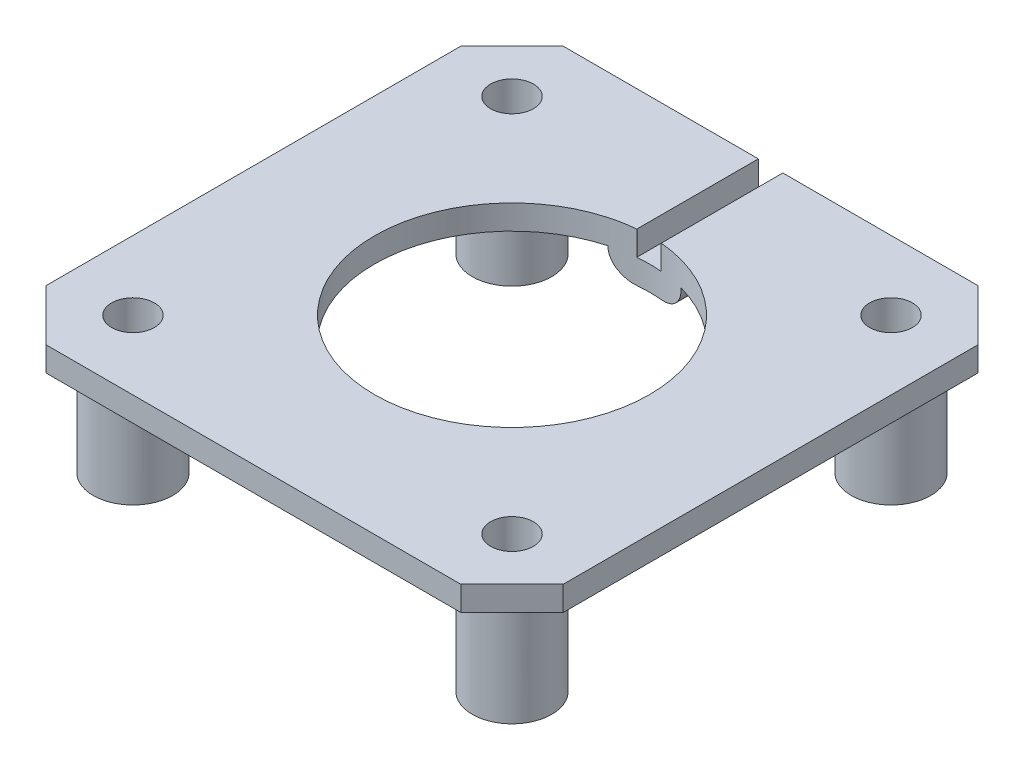
ISO-10303-21;
HEADER;
FILE_DESCRIPTION(('STEP AP214'),'2;1');
FILE_NAME('part.step','',(''),(''),'','','');
FILE_SCHEMA(('AUTOMOTIVE_DESIGN { 1 0 10303 214 1 1 1 1 }'));
ENDSEC;
DATA;
#1=APPLICATION_CONTEXT('core data for automotive mechanical design processes');
#2=APPLICATION_PROTOCOL_DEFINITION('international standard','automotive_design',2000,#1);
#3=PRODUCT_CONTEXT('',#1,'mechanical');
#4=PRODUCT('Part','Part','',(#3));
#5=PRODUCT_RELATED_PRODUCT_CATEGORY('part','',(#4));
#6=PRODUCT_DEFINITION_FORMATION('','',#4);
#7=PRODUCT_DEFINITION_CONTEXT('part definition',#1,'design');
#8=PRODUCT_DEFINITION('design','',#6,#7);
#9=PRODUCT_DEFINITION_SHAPE('','',#8);
#10=(LENGTH_UNIT() NAMED_UNIT(*) SI_UNIT(.MILLI.,.METRE.));
#11=(NAMED_UNIT(*) PLANE_ANGLE_UNIT() SI_UNIT($,.RADIAN.));
#12=(NAMED_UNIT(*) SI_UNIT($,.STERADIAN.) SOLID_ANGLE_UNIT());
#13=UNCERTAINTY_MEASURE_WITH_UNIT(LENGTH_MEASURE(1.E-05),#10,'distance_accuracy_value','');
#14=(GEOMETRIC_REPRESENTATION_CONTEXT(3) GLOBAL_UNCERTAINTY_ASSIGNED_CONTEXT((#13)) GLOBAL_UNIT_ASSIGNED_CONTEXT((#10,
#11,#12)) REPRESENTATION_CONTEXT('',''));
#15=CARTESIAN_POINT('',(0.,0.,0.));
#16=DIRECTION('',(0.,0.,1.));
#17=DIRECTION('',(1.,0.,0.));
#18=AXIS2_PLACEMENT_3D('',#15,#16,#17);
#19=CARTESIAN_POINT('',(0.,9.15,0.));
#20=DIRECTION('',(0.,1.,0.));
#21=DIRECTION('',(0.,0.,1.));
#22=AXIS2_PLACEMENT_3D('',#19,#20,#21);
#23=PLANE('',#22);
#24=CARTESIAN_POINT('',(-15.5,9.15,-15.5));
#25=DIRECTION('',(0.,1.,0.));
#26=DIRECTION('',(0.,0.,1.));
#27=AXIS2_PLACEMENT_3D('',#24,#25,#26);
#28=CIRCLE('',#27,3.25);
#29=CARTESIAN_POINT('',(-15.5,9.15,-12.25));
#30=VERTEX_POINT('',#29);
#31=EDGE_CURVE('E301',#30,#30,#28,.T.);
#32=ORIENTED_EDGE('',*,*,#31,.T.);
#33=EDGE_LOOP('',(#32));
#34=FACE_BOUND('',#33,.T.);
#35=CARTESIAN_POINT('',(15.5,9.15,-15.5));
#36=DIRECTION('',(0.,1.,0.));
#37=DIRECTION('',(0.,0.,1.));
#38=AXIS2_PLACEMENT_3D('',#35,#36,#37);
#39=CIRCLE('',#38,3.25);
#40=CARTESIAN_POINT('',(15.5,9.15,-12.25));
#41=VERTEX_POINT('',#40);
#42=EDGE_CURVE('E295',#41,#41,#39,.F.);
#43=ORIENTED_EDGE('',*,*,#42,.F.);
#44=EDGE_LOOP('',(#43));
#45=FACE_BOUND('',#44,.T.);
#46=CARTESIAN_POINT('',(-15.5,9.15,15.5));
#47=DIRECTION('',(0.,1.,0.));
#48=DIRECTION('',(0.,0.,1.));
#49=AXIS2_PLACEMENT_3D('',#46,#47,#48);
#50=CIRCLE('',#49,3.25);
#51=CARTESIAN_POINT('',(-15.5,9.15,18.75));
#52=VERTEX_POINT('',#51);
#53=EDGE_CURVE('E289',#52,#52,#50,.F.);
#54=ORIENTED_EDGE('',*,*,#53,.F.);
#55=EDGE_LOOP('',(#54));
#56=FACE_BOUND('',#55,.T.);
#57=CARTESIAN_POINT('',(15.5,9.15,15.5));
#58=DIRECTION('',(0.,1.,0.));
#59=DIRECTION('',(0.,0.,1.));
#60=AXIS2_PLACEMENT_3D('',#57,#58,#59);
#61=CIRCLE('',#60,3.25);
#62=CARTESIAN_POINT('',(15.5,9.15,18.75));
#63=VERTEX_POINT('',#62);
#64=EDGE_CURVE('E286',#63,#63,#61,.F.);
#65=ORIENTED_EDGE('',*,*,#64,.F.);
#66=EDGE_LOOP('',(#65));
#67=FACE_BOUND('',#66,.T.);
#68=DIRECTION('',(0.,0.,1.));
#69=VECTOR('',#68,1.);
#70=CARTESIAN_POINT('',(3.,9.15,-21.15));
#71=LINE('',#70,#69);
#72=CARTESIAN_POINT('',(3.,9.15,-21.15));
#73=VERTEX_POINT('',#72);
#74=CARTESIAN_POINT('',(3.,9.15,-10.8426242211007));
#75=VERTEX_POINT('',#74);
#76=EDGE_CURVE('E206',#73,#75,#71,.T.);
#77=ORIENTED_EDGE('',*,*,#76,.F.);
#78=DIRECTION('',(-1.,0.,0.));
#79=VECTOR('',#78,1.);
#80=CARTESIAN_POINT('',(-21.15,9.15,-21.15));
#81=LINE('',#80,#79);
#82=CARTESIAN_POINT('',(16.9630555059549,9.15,-21.15));
#83=VERTEX_POINT('',#82);
#84=EDGE_CURVE('E313',#83,#73,#81,.T.);
#85=ORIENTED_EDGE('',*,*,#84,.F.);
#86=DIRECTION('',(-0.707106781186546,0.,-0.707106781186549));
#87=VECTOR('',#86,1.);
#88=CARTESIAN_POINT('',(19.0565277529775,9.15,-19.0565277529774));
#89=LINE('',#88,#87);
#90=CARTESIAN_POINT('',(21.15,9.15,-16.9630555059549));
#91=VERTEX_POINT('',#90);
#92=EDGE_CURVE('E249',#91,#83,#89,.T.);
#93=ORIENTED_EDGE('',*,*,#92,.F.);
#94=DIRECTION('',(0.,0.,-1.));
#95=VECTOR('',#94,1.);
#96=CARTESIAN_POINT('',(21.15,9.15,-21.15));
#97=LINE('',#96,#95);
#98=CARTESIAN_POINT('',(21.15,9.15,16.9630555059549));
#99=VERTEX_POINT('',#98);
#100=EDGE_CURVE('E308',#99,#91,#97,.T.);
#101=ORIENTED_EDGE('',*,*,#100,.F.);
#102=DIRECTION('',(-0.707106781186546,0.,0.707106781186549));
#103=VECTOR('',#102,1.);
#104=CARTESIAN_POINT('',(19.0565277529775,9.15,19.0565277529774));
#105=LINE('',#104,#103);
#106=CARTESIAN_POINT('',(16.9630555059549,9.15,21.15));
#107=VERTEX_POINT('',#106);
#108=EDGE_CURVE('E269',#99,#107,#105,.T.);
#109=ORIENTED_EDGE('',*,*,#108,.T.);
#110=DIRECTION('',(1.,0.,0.));
#111=VECTOR('',#110,1.);
#112=CARTESIAN_POINT('',(-21.15,9.15,21.15));
#113=LINE('',#112,#111);
#114=CARTESIAN_POINT('',(-16.9630555059549,9.15,21.15));
#115=VERTEX_POINT('',#114);
#116=EDGE_CURVE('E319',#115,#107,#113,.T.);
#117=ORIENTED_EDGE('',*,*,#116,.F.);
#118=DIRECTION('',(0.707106781186546,0.,0.707106781186549));
#119=VECTOR('',#118,1.);
#120=CARTESIAN_POINT('',(-19.0565277529775,9.15,19.0565277529774));
#121=LINE('',#120,#119);
#122=CARTESIAN_POINT('',(-21.15,9.15,16.9630555059549));
#123=VERTEX_POINT('',#122);
#124=EDGE_CURVE('E258',#123,#115,#121,.T.);
#125=ORIENTED_EDGE('',*,*,#124,.F.);
#126=DIRECTION('',(0.,0.,1.));
#127=VECTOR('',#126,1.);
#128=CARTESIAN_POINT('',(-21.15,9.15,-21.15));
#129=LINE('',#128,#127);
#130=CARTESIAN_POINT('',(-21.15,9.15,-16.9630555059549));
#131=VERTEX_POINT('',#130);
#132=EDGE_CURVE('E316',#131,#123,#129,.T.);
#133=ORIENTED_EDGE('',*,*,#132,.F.);
#134=DIRECTION('',(0.707106781186546,0.,-0.707106781186549));
#135=VECTOR('',#134,1.);
#136=CARTESIAN_POINT('',(-19.0565277529775,9.15,-19.0565277529774));
#137=LINE('',#136,#135);
#138=CARTESIAN_POINT('',(-16.9630555059549,9.15,-21.15));
#139=VERTEX_POINT('',#138);
#140=EDGE_CURVE('E279',#131,#139,#137,.T.);
#141=ORIENTED_EDGE('',*,*,#140,.T.);
#142=CARTESIAN_POINT('',(-3.,9.15,-21.15));
#143=VERTEX_POINT('',#142);
#144=EDGE_CURVE('E311',#143,#139,#81,.T.);
#145=ORIENTED_EDGE('',*,*,#144,.F.);
#146=DIRECTION('',(0.,0.,-1.));
#147=VECTOR('',#146,1.);
#148=CARTESIAN_POINT('',(-3.,9.15,-21.15));
#149=LINE('',#148,#147);
#150=CARTESIAN_POINT('',(-3.,9.15,-10.8426242211007));
#151=VERTEX_POINT('',#150);
#152=EDGE_CURVE('E211',#151,#143,#149,.T.);
#153=ORIENTED_EDGE('',*,*,#152,.F.);
#154=CARTESIAN_POINT('',(0.,9.15,0.));
#155=DIRECTION('',(0.,1.,0.));
#156=DIRECTION('',(0.,0.,1.));
#157=AXIS2_PLACEMENT_3D('',#154,#155,#156);
#158=CIRCLE('',#157,11.25);
#159=EDGE_CURVE('E302',#151,#75,#158,.T.);
#160=ORIENTED_EDGE('',*,*,#159,.T.);
#161=EDGE_LOOP('',(#77,#85,#93,#101,#109,#117,#125,#133,#141,#145,#153,#160));
#162=FACE_BOUND('',#161,.T.);
#163=ADVANCED_FACE('F37',(#34,#45,#56,#67,#162),#23,.F.);
#164=CARTESIAN_POINT('',(21.15,9.15,-21.15));
#165=DIRECTION('',(1.,0.,0.));
#166=DIRECTION('',(0.,0.,-1.));
#167=AXIS2_PLACEMENT_3D('',#164,#165,#166);
#168=PLANE('',#167);
#169=ORIENTED_EDGE('',*,*,#100,.T.);
#170=DIRECTION('',(0.,1.,0.));
#171=VECTOR('',#170,1.);
#172=CARTESIAN_POINT('',(21.15,0.,-16.9630555059549));
#173=LINE('',#172,#171);
#174=CARTESIAN_POINT('',(21.15,11.15,-16.9630555059549));
#175=VERTEX_POINT('',#174);
#176=EDGE_CURVE('E245',#91,#175,#173,.T.);
#177=ORIENTED_EDGE('',*,*,#176,.T.);
#178=DIRECTION('',(0.,0.,-1.));
#179=VECTOR('',#178,1.);
#180=CARTESIAN_POINT('',(21.15,11.15,-21.15));
#181=LINE('',#180,#179);
#182=CARTESIAN_POINT('',(21.15,11.15,16.9630555059549));
#183=VERTEX_POINT('',#182);
#184=EDGE_CURVE('E305',#183,#175,#181,.T.);
#185=ORIENTED_EDGE('',*,*,#184,.F.);
#186=DIRECTION('',(0.,1.,0.));
#187=VECTOR('',#186,1.);
#188=CARTESIAN_POINT('',(21.15,0.,16.9630555059549));
#189=LINE('',#188,#187);
#190=EDGE_CURVE('E273',#99,#183,#189,.T.);
#191=ORIENTED_EDGE('',*,*,#190,.F.);
#192=EDGE_LOOP('',(#169,#177,#185,#191));
#193=FACE_BOUND('',#192,.T.);
#194=ADVANCED_FACE('F368',(#193),#168,.T.);
#195=CARTESIAN_POINT('',(-21.15,9.15,21.15));
#196=DIRECTION('',(0.,0.,1.));
#197=DIRECTION('',(1.,0.,0.));
#198=AXIS2_PLACEMENT_3D('',#195,#196,#197);
#199=PLANE('',#198);
#200=DIRECTION('',(1.,0.,0.));
#201=VECTOR('',#200,1.);
#202=CARTESIAN_POINT('',(-21.15,11.15,21.15));
#203=LINE('',#202,#201);
#204=CARTESIAN_POINT('',(-16.9630555059549,11.15,21.15));
#205=VERTEX_POINT('',#204);
#206=CARTESIAN_POINT('',(16.9630555059549,11.15,21.15));
#207=VERTEX_POINT('',#206);
#208=EDGE_CURVE('E312',#205,#207,#203,.T.);
#209=ORIENTED_EDGE('',*,*,#208,.F.);
#210=DIRECTION('',(0.,1.,0.));
#211=VECTOR('',#210,1.);
#212=CARTESIAN_POINT('',(-16.9630555059549,0.,21.15));
#213=LINE('',#212,#211);
#214=EDGE_CURVE('E244',#115,#205,#213,.T.);
#215=ORIENTED_EDGE('',*,*,#214,.F.);
#216=ORIENTED_EDGE('',*,*,#116,.T.);
#217=DIRECTION('',(0.,1.,0.));
#218=VECTOR('',#217,1.);
#219=CARTESIAN_POINT('',(16.9630555059549,0.,21.15));
#220=LINE('',#219,#218);
#221=EDGE_CURVE('E265',#107,#207,#220,.T.);
#222=ORIENTED_EDGE('',*,*,#221,.T.);
#223=EDGE_LOOP('',(#209,#215,#216,#222));
#224=FACE_BOUND('',#223,.T.);
#225=ADVANCED_FACE('F370',(#224),#199,.T.);
#226=CARTESIAN_POINT('',(-21.15,9.15,-21.15));
#227=DIRECTION('',(-1.,0.,0.));
#228=DIRECTION('',(0.,0.,1.));
#229=AXIS2_PLACEMENT_3D('',#226,#227,#228);
#230=PLANE('',#229);
#231=ORIENTED_EDGE('',*,*,#132,.T.);
#232=DIRECTION('',(0.,1.,0.));
#233=VECTOR('',#232,1.);
#234=CARTESIAN_POINT('',(-21.15,0.,16.9630555059549));
#235=LINE('',#234,#233);
#236=CARTESIAN_POINT('',(-21.15,11.15,16.9630555059549));
#237=VERTEX_POINT('',#236);
#238=EDGE_CURVE('E246',#123,#237,#235,.T.);
#239=ORIENTED_EDGE('',*,*,#238,.T.);
#240=DIRECTION('',(0.,0.,1.));
#241=VECTOR('',#240,1.);
#242=CARTESIAN_POINT('',(-21.15,11.15,-21.15));
#243=LINE('',#242,#241);
#244=CARTESIAN_POINT('',(-21.15,11.15,-16.9630555059549));
#245=VERTEX_POINT('',#244);
#246=EDGE_CURVE('E328',#245,#237,#243,.T.);
#247=ORIENTED_EDGE('',*,*,#246,.F.);
#248=DIRECTION('',(0.,1.,0.));
#249=VECTOR('',#248,1.);
#250=CARTESIAN_POINT('',(-21.15,0.,-16.9630555059549));
#251=LINE('',#250,#249);
#252=EDGE_CURVE('E264',#131,#245,#251,.T.);
#253=ORIENTED_EDGE('',*,*,#252,.F.);
#254=EDGE_LOOP('',(#231,#239,#247,#253));
#255=FACE_BOUND('',#254,.T.);
#256=ADVANCED_FACE('F373',(#255),#230,.T.);
#257=CARTESIAN_POINT('',(-21.15,9.15,-21.15));
#258=DIRECTION('',(0.,0.,-1.));
#259=DIRECTION('',(-1.,0.,0.));
#260=AXIS2_PLACEMENT_3D('',#257,#258,#259);
#261=PLANE('',#260);
#262=ORIENTED_EDGE('',*,*,#84,.T.);
#263=CARTESIAN_POINT('',(1.,9.15,-21.15));
#264=DIRECTION('',(0.,0.,-1.));
#265=DIRECTION('',(-1.,0.,0.));
#266=AXIS2_PLACEMENT_3D('',#263,#264,#265);
#267=CIRCLE('',#266,2.);
#268=CARTESIAN_POINT('',(1.,7.15,-21.15));
#269=VERTEX_POINT('',#268);
#270=EDGE_CURVE('E11',#73,#269,#267,.T.);
#271=ORIENTED_EDGE('',*,*,#270,.T.);
#272=DIRECTION('',(1.,0.,0.));
#273=VECTOR('',#272,1.);
#274=CARTESIAN_POINT('',(3.,7.15,-21.15));
#275=LINE('',#274,#273);
#276=CARTESIAN_POINT('',(-1.,7.15,-21.15));
#277=VERTEX_POINT('',#276);
#278=EDGE_CURVE('E207',#277,#269,#275,.T.);
#279=ORIENTED_EDGE('',*,*,#278,.F.);
#280=CARTESIAN_POINT('',(-1.,9.15,-21.15));
#281=DIRECTION('',(0.,0.,-1.));
#282=DIRECTION('',(-1.,0.,0.));
#283=AXIS2_PLACEMENT_3D('',#280,#281,#282);
#284=CIRCLE('',#283,2.);
#285=EDGE_CURVE('E46',#277,#143,#284,.T.);
#286=ORIENTED_EDGE('',*,*,#285,.T.);
#287=ORIENTED_EDGE('',*,*,#144,.T.);
#288=DIRECTION('',(0.,1.,0.));
#289=VECTOR('',#288,1.);
#290=CARTESIAN_POINT('',(-16.9630555059549,0.,-21.15));
#291=LINE('',#290,#289);
#292=CARTESIAN_POINT('',(-16.9630555059549,11.15,-21.15));
#293=VERTEX_POINT('',#292);
#294=EDGE_CURVE('E266',#139,#293,#291,.T.);
#295=ORIENTED_EDGE('',*,*,#294,.T.);
#296=DIRECTION('',(-1.,0.,0.));
#297=VECTOR('',#296,1.);
#298=CARTESIAN_POINT('',(-21.15,11.15,-21.15));
#299=LINE('',#298,#297);
#300=CARTESIAN_POINT('',(-1.,11.15,-21.15));
#301=VERTEX_POINT('',#300);
#302=EDGE_CURVE('E324',#301,#293,#299,.T.);
#303=ORIENTED_EDGE('',*,*,#302,.F.);
#304=DIRECTION('',(0.,1.,0.));
#305=VECTOR('',#304,1.);
#306=CARTESIAN_POINT('',(-1.,9.15,-21.15));
#307=LINE('',#306,#305);
#308=CARTESIAN_POINT('',(-1.,9.15,-21.15));
#309=VERTEX_POINT('',#308);
#310=EDGE_CURVE('E202',#309,#301,#307,.T.);
#311=ORIENTED_EDGE('',*,*,#310,.F.);
#312=DIRECTION('',(1.,0.,0.));
#313=VECTOR('',#312,1.);
#314=CARTESIAN_POINT('',(-21.15,9.15,-21.15));
#315=LINE('',#314,#313);
#316=CARTESIAN_POINT('',(1.00000000000002,9.15,-21.15));
#317=VERTEX_POINT('',#316);
#318=EDGE_CURVE('E201',#309,#317,#315,.T.);
#319=ORIENTED_EDGE('',*,*,#318,.T.);
#320=DIRECTION('',(0.,1.,0.));
#321=VECTOR('',#320,1.);
#322=CARTESIAN_POINT('',(1.00000000000002,9.15,-21.15));
#323=LINE('',#322,#321);
#324=CARTESIAN_POINT('',(1.00000000000002,11.15,-21.15));
#325=VERTEX_POINT('',#324);
#326=EDGE_CURVE('E185',#317,#325,#323,.T.);
#327=ORIENTED_EDGE('',*,*,#326,.T.);
#328=CARTESIAN_POINT('',(16.9630555059549,11.15,-21.15));
#329=VERTEX_POINT('',#328);
#330=EDGE_CURVE('E325',#329,#325,#299,.T.);
#331=ORIENTED_EDGE('',*,*,#330,.F.);
#332=DIRECTION('',(0.,1.,0.));
#333=VECTOR('',#332,1.);
#334=CARTESIAN_POINT('',(16.9630555059549,0.,-21.15));
#335=LINE('',#334,#333);
#336=EDGE_CURVE('E253',#83,#329,#335,.T.);
#337=ORIENTED_EDGE('',*,*,#336,.F.);
#338=EDGE_LOOP('',(#262,#271,#279,#286,#287,#295,#303,#311,#319,#327,#331,#337));
#339=FACE_BOUND('',#338,.T.);
#340=ADVANCED_FACE('F377',(#339),#261,.T.);
#341=CARTESIAN_POINT('',(-15.5,11.15,-15.5));
#342=DIRECTION('',(0.,1.,0.));
#343=DIRECTION('',(0.,0.,1.));
#344=AXIS2_PLACEMENT_3D('',#341,#342,#343);
#345=PLANE('',#344);
#346=CARTESIAN_POINT('',(0.,11.15,-11.25));
#347=DIRECTION('',(0.,1.,0.));
#348=DIRECTION('',(0.,0.,1.));
#349=AXIS2_PLACEMENT_3D('',#346,#347,#348);
#350=CIRCLE('',#349,1.);
#351=CARTESIAN_POINT('',(-1.,11.15,-11.25));
#352=VERTEX_POINT('',#351);
#353=CARTESIAN_POINT('',(-0.999011857466179,11.15,-11.2055555555556));
#354=VERTEX_POINT('',#353);
#355=EDGE_CURVE('E193',#352,#354,#350,.T.);
#356=ORIENTED_EDGE('',*,*,#355,.F.);
#357=DIRECTION('',(0.,0.,1.));
#358=VECTOR('',#357,1.);
#359=CARTESIAN_POINT('',(-1.,11.15,-11.25));
#360=LINE('',#359,#358);
#361=EDGE_CURVE('E176',#301,#352,#360,.T.);
#362=ORIENTED_EDGE('',*,*,#361,.F.);
#363=ORIENTED_EDGE('',*,*,#302,.T.);
#364=DIRECTION('',(0.707106781186546,0.,-0.707106781186549));
#365=VECTOR('',#364,1.);
#366=CARTESIAN_POINT('',(-16.9630555059549,11.15,-21.15));
#367=LINE('',#366,#365);
#368=EDGE_CURVE('E261',#245,#293,#367,.T.);
#369=ORIENTED_EDGE('',*,*,#368,.F.);
#370=ORIENTED_EDGE('',*,*,#246,.T.);
#371=DIRECTION('',(0.707106781186546,0.,0.707106781186549));
#372=VECTOR('',#371,1.);
#373=CARTESIAN_POINT('',(-16.9630555059549,11.15,21.15));
#374=LINE('',#373,#372);
#375=EDGE_CURVE('E241',#237,#205,#374,.T.);
#376=ORIENTED_EDGE('',*,*,#375,.T.);
#377=ORIENTED_EDGE('',*,*,#208,.T.);
#378=DIRECTION('',(-0.707106781186546,0.,0.707106781186549));
#379=VECTOR('',#378,1.);
#380=CARTESIAN_POINT('',(16.9630555059549,11.15,21.15));
#381=LINE('',#380,#379);
#382=EDGE_CURVE('E260',#183,#207,#381,.T.);
#383=ORIENTED_EDGE('',*,*,#382,.F.);
#384=ORIENTED_EDGE('',*,*,#184,.T.);
#385=DIRECTION('',(-0.707106781186546,0.,-0.707106781186549));
#386=VECTOR('',#385,1.);
#387=CARTESIAN_POINT('',(16.9630555059549,11.15,-21.15));
#388=LINE('',#387,#386);
#389=EDGE_CURVE('E238',#175,#329,#388,.T.);
#390=ORIENTED_EDGE('',*,*,#389,.T.);
#391=ORIENTED_EDGE('',*,*,#330,.T.);
#392=DIRECTION('',(0.,0.,-1.));
#393=VECTOR('',#392,1.);
#394=CARTESIAN_POINT('',(1.,11.15,-11.25));
#395=LINE('',#394,#393);
#396=CARTESIAN_POINT('',(1.,11.15,-11.25));
#397=VERTEX_POINT('',#396);
#398=EDGE_CURVE('E195',#397,#325,#395,.T.);
#399=ORIENTED_EDGE('',*,*,#398,.F.);
#400=CARTESIAN_POINT('',(0.999011857466179,11.15,-11.2055555555556));
#401=VERTEX_POINT('',#400);
#402=EDGE_CURVE('E182',#401,#397,#350,.T.);
#403=ORIENTED_EDGE('',*,*,#402,.F.);
#404=CARTESIAN_POINT('',(0.,11.15,0.));
#405=DIRECTION('',(0.,1.,0.));
#406=DIRECTION('',(0.,0.,1.));
#407=AXIS2_PLACEMENT_3D('',#404,#405,#406);
#408=CIRCLE('',#407,11.25);
#409=EDGE_CURVE('E298',#354,#401,#408,.T.);
#410=ORIENTED_EDGE('',*,*,#409,.F.);
#411=EDGE_LOOP('',(#356,#362,#363,#369,#370,#376,#377,#383,#384,#390,#391,#399,#403,#410));
#412=FACE_BOUND('',#411,.T.);
#413=CARTESIAN_POINT('',(15.5,11.15,15.5));
#414=DIRECTION('',(0.,1.,0.));
#415=DIRECTION('',(0.,0.,1.));
#416=AXIS2_PLACEMENT_3D('',#413,#414,#415);
#417=CIRCLE('',#416,1.75);
#418=CARTESIAN_POINT('',(15.5,11.15,17.25));
#419=VERTEX_POINT('',#418);
#420=EDGE_CURVE('E217',#419,#419,#417,.T.);
#421=ORIENTED_EDGE('',*,*,#420,.F.);
#422=EDGE_LOOP('',(#421));
#423=FACE_BOUND('',#422,.T.);
#424=CARTESIAN_POINT('',(-15.5,11.15,15.5));
#425=DIRECTION('',(0.,-1.,0.));
#426=DIRECTION('',(0.,0.,1.));
#427=AXIS2_PLACEMENT_3D('',#424,#425,#426);
#428=CIRCLE('',#427,1.75);
#429=CARTESIAN_POINT('',(-15.5,11.15,17.25));
#430=VERTEX_POINT('',#429);
#431=EDGE_CURVE('E223',#430,#430,#428,.T.);
#432=ORIENTED_EDGE('',*,*,#431,.T.);
#433=EDGE_LOOP('',(#432));
#434=FACE_BOUND('',#433,.T.);
#435=CARTESIAN_POINT('',(-15.5,11.15,-15.5));
#436=DIRECTION('',(0.,1.,0.));
#437=DIRECTION('',(0.,0.,-1.));
#438=AXIS2_PLACEMENT_3D('',#435,#436,#437);
#439=CIRCLE('',#438,1.75);
#440=CARTESIAN_POINT('',(-15.5,11.15,-17.25));
#441=VERTEX_POINT('',#440);
#442=EDGE_CURVE('E229',#441,#441,#439,.T.);
#443=ORIENTED_EDGE('',*,*,#442,.F.);
#444=EDGE_LOOP('',(#443));
#445=FACE_BOUND('',#444,.T.);
#446=CARTESIAN_POINT('',(15.5,11.15,-15.5));
#447=DIRECTION('',(0.,-1.,0.));
#448=DIRECTION('',(0.,0.,-1.));
#449=AXIS2_PLACEMENT_3D('',#446,#447,#448);
#450=CIRCLE('',#449,1.75);
#451=CARTESIAN_POINT('',(15.5,11.15,-17.25));
#452=VERTEX_POINT('',#451);
#453=EDGE_CURVE('E235',#452,#452,#450,.T.);
#454=ORIENTED_EDGE('',*,*,#453,.T.);
#455=EDGE_LOOP('',(#454));
#456=FACE_BOUND('',#455,.T.);
#457=ADVANCED_FACE('F381',(#412,#423,#434,#445,#456),#345,.T.);
#458=CARTESIAN_POINT('',(-15.5,11.15,-15.5));
#459=DIRECTION('',(0.,-1.,0.));
#460=DIRECTION('',(0.,0.,-1.));
#461=AXIS2_PLACEMENT_3D('',#458,#459,#460);
#462=CYLINDRICAL_SURFACE('',#461,3.25);
#463=CARTESIAN_POINT('',(-15.5,0.,-15.5));
#464=DIRECTION('',(0.,1.,0.));
#465=DIRECTION('',(0.,0.,1.));
#466=AXIS2_PLACEMENT_3D('',#463,#464,#465);
#467=CIRCLE('',#466,3.25);
#468=CARTESIAN_POINT('',(-15.5,0.,-12.25));
#469=VERTEX_POINT('',#468);
#470=EDGE_CURVE('E321',#469,#469,#467,.T.);
#471=ORIENTED_EDGE('',*,*,#470,.T.);
#472=EDGE_LOOP('',(#471));
#473=FACE_BOUND('',#472,.T.);
#474=ORIENTED_EDGE('',*,*,#31,.F.);
#475=EDGE_LOOP('',(#474));
#476=FACE_BOUND('',#475,.T.);
#477=ADVANCED_FACE('F388',(#473,#476),#462,.T.);
#478=CARTESIAN_POINT('',(-15.5,0.,-15.5));
#479=DIRECTION('',(0.,1.,0.));
#480=DIRECTION('',(0.,0.,1.));
#481=AXIS2_PLACEMENT_3D('',#478,#479,#480);
#482=PLANE('',#481);
#483=CARTESIAN_POINT('',(-15.5,0.,-15.5));
#484=DIRECTION('',(0.,1.,0.));
#485=DIRECTION('',(0.,0.,-1.));
#486=AXIS2_PLACEMENT_3D('',#483,#484,#485);
#487=CIRCLE('',#486,1.75);
#488=CARTESIAN_POINT('',(-15.5,0.,-17.25));
#489=VERTEX_POINT('',#488);
#490=EDGE_CURVE('E226',#489,#489,#487,.T.);
#491=ORIENTED_EDGE('',*,*,#490,.T.);
#492=EDGE_LOOP('',(#491));
#493=FACE_BOUND('',#492,.T.);
#494=ORIENTED_EDGE('',*,*,#470,.F.);
#495=EDGE_LOOP('',(#494));
#496=FACE_BOUND('',#495,.T.);
#497=ADVANCED_FACE('F363',(#493,#496),#482,.F.);
#498=CARTESIAN_POINT('',(0.,9.15,0.));
#499=DIRECTION('',(0.,1.,0.));
#500=DIRECTION('',(0.,0.,1.));
#501=AXIS2_PLACEMENT_3D('',#498,#499,#500);
#502=CYLINDRICAL_SURFACE('',#501,11.25);
#503=CARTESIAN_POINT('',(0.,7.15,0.));
#504=DIRECTION('',(0.,1.,0.));
#505=DIRECTION('',(0.,0.,-1.));
#506=AXIS2_PLACEMENT_3D('',#503,#504,#505);
#507=CIRCLE('',#506,11.25);
#508=CARTESIAN_POINT('',(1.,7.15,-11.2054674155075));
#509=VERTEX_POINT('',#508);
#510=CARTESIAN_POINT('',(-1.,7.15,-11.2054674155075));
#511=VERTEX_POINT('',#510);
#512=EDGE_CURVE('E210',#509,#511,#507,.T.);
#513=ORIENTED_EDGE('',*,*,#512,.F.);
#514=CARTESIAN_POINT('',(1.,7.15,-11.2054674155075));
#515=CARTESIAN_POINT('',(1.05652137712966,7.14999995922506,-11.2004257536843));
#516=CARTESIAN_POINT('',(1.11297515675127,7.1523973819327,-11.1949536908237));
#517=CARTESIAN_POINT('',(1.22538675989289,7.16193940944393,-11.1832067239525));
#518=CARTESIAN_POINT('',(1.28134466321158,7.16908323584159,-11.1769319517217));
#519=CARTESIAN_POINT('',(1.44769378111679,7.19751816410484,-11.1570198182803));
#520=CARTESIAN_POINT('',(1.55683613429646,7.22581322564727,-11.1422697881196));
#521=CARTESIAN_POINT('',(1.76849510152452,7.30013098345242,-11.1106440023832));
#522=CARTESIAN_POINT('',(1.87101213744284,7.34615254967092,-11.0937683823577));
#523=CARTESIAN_POINT('',(2.06681345417186,7.45458581736687,-11.0589634956746));
#524=CARTESIAN_POINT('',(2.16009607049488,7.51700046628849,-11.0410340399899));
#525=CARTESIAN_POINT('',(2.33619988215312,7.65753811158261,-11.0051294520018));
#526=CARTESIAN_POINT('',(2.41885411895511,7.73587115252221,-10.9871572721465));
#527=CARTESIAN_POINT('',(2.56985602888053,7.90563084085191,-10.9528238371631));
#528=CARTESIAN_POINT('',(2.63820159379141,7.99705941437544,-10.9364628196085));
#529=CARTESIAN_POINT('',(2.75841811332296,8.19036523778903,-10.9067625762617));
#530=CARTESIAN_POINT('',(2.81032126724105,8.29222154258665,-10.8934174592911));
#531=CARTESIAN_POINT('',(2.89610466791204,8.50364853051089,-10.8709273048526));
#532=CARTESIAN_POINT('',(2.93000238664585,8.6132116178144,-10.8617781968746));
#533=CARTESIAN_POINT('',(2.96947729341388,8.79466232011538,-10.8510344482646));
#534=CARTESIAN_POINT('',(2.98090994043087,8.86523792047891,-10.8478929678433));
#535=CARTESIAN_POINT('',(2.99617285653093,9.00719639337706,-10.843683307826));
#536=CARTESIAN_POINT('',(3.00001058368593,9.0785784046682,-10.8426130943068));
#537=CARTESIAN_POINT('',(3.,9.15,-10.8426242211007));
#538=B_SPLINE_CURVE_WITH_KNOTS('',3,(#514,#515,#516,#517,#518,#519,#520,#521,#522,#523,#524,
#525,#526,#527,#528,#529,#530,#531,#532,#533,#534,#535,#536,#537),.UNSPECIFIED.,.F.,.F.,(4,2,2,
2,2,2,2,2,2,2,2,4),(0.,0.170128491910598,0.340229089787075,0.679610505052962,1.0189702887252,
1.35839113044093,1.70262130865555,2.04690216945286,2.39050459390637,2.7337729840338,
2.94806155601856,3.16213959593741),.UNSPECIFIED.);
#539=EDGE_CURVE('E61',#509,#75,#538,.T.);
#540=ORIENTED_EDGE('',*,*,#539,.T.);
#541=ORIENTED_EDGE('',*,*,#159,.F.);
#542=CARTESIAN_POINT('',(-3.,9.15,-10.8426242211007));
#543=CARTESIAN_POINT('',(-3.00000077265228,9.09492821045946,-10.8426214970644));
#544=CARTESIAN_POINT('',(-2.99772384986868,9.03988367925963,-10.8432542659089));
#545=CARTESIAN_POINT('',(-2.98864784338186,8.93020614719148,-10.8457603257705));
#546=CARTESIAN_POINT('',(-2.98184950466578,8.87557308002635,-10.8476334124221));
#547=CARTESIAN_POINT('',(-2.95477478323023,8.71312147996809,-10.8550530663965));
#548=CARTESIAN_POINT('',(-2.92781823037414,8.60641930337641,-10.8624003934926));
#549=CARTESIAN_POINT('',(-2.85698623559565,8.39926421617698,-10.8812432131608));
#550=CARTESIAN_POINT('',(-2.81311199105812,8.29881086387989,-10.8927384121549));
#551=CARTESIAN_POINT('',(-2.70979073308613,8.10668223593181,-10.9188994331417));
#552=CARTESIAN_POINT('',(-2.65033947654842,8.01500936134617,-10.9335661188417));
#553=CARTESIAN_POINT('',(-2.51616162541191,7.84096199779655,-10.9652299172544));
#554=CARTESIAN_POINT('',(-2.44114338062998,7.75882021225518,-10.9822691096306));
#555=CARTESIAN_POINT('',(-2.27863872228586,7.60812927443286,-11.0171321755556));
#556=CARTESIAN_POINT('',(-2.19114889235998,7.53958385897482,-11.0349562631846));
#557=CARTESIAN_POINT('',(-2.00362052827604,7.41631758572695,-11.0705614790249));
#558=CARTESIAN_POINT('',(-1.90332010513211,7.36199123413397,-11.0883300637907));
#559=CARTESIAN_POINT('',(-1.69473277375296,7.27109902899055,-11.1221182782178));
#560=CARTESIAN_POINT('',(-1.58645124143371,7.23452134397359,-11.1381390674422));
#561=CARTESIAN_POINT('',(-1.3980932920637,7.18838880425529,-11.1630628069744));
#562=CARTESIAN_POINT('',(-1.3192538751319,7.17402563868302,-11.1726623996293));
#563=CARTESIAN_POINT('',(-1.16031707883083,7.15482696012574,-11.190291961602));
#564=CARTESIAN_POINT('',(-1.08022075050333,7.14998387394915,-11.1983231739763));
#565=CARTESIAN_POINT('',(-1.,7.15,-11.2054674155075));
#566=B_SPLINE_CURVE_WITH_KNOTS('',3,(#542,#543,#544,#545,#546,#547,#548,#549,#550,#551,#552,
#553,#554,#555,#556,#557,#558,#559,#560,#561,#562,#563,#564,#565),.UNSPECIFIED.,.F.,.F.,(4,2,2,
2,2,2,2,2,2,2,2,4),(0.,0.165111038552442,0.33019487873667,0.659381801419234,0.988545429487206,
1.31779881353074,1.65389151701287,1.99007646452764,2.33478379439488,2.67926102160539,
2.9208352840488,3.16221729707318),.UNSPECIFIED.);
#567=EDGE_CURVE('E53',#151,#511,#566,.T.);
#568=ORIENTED_EDGE('',*,*,#567,.T.);
#569=EDGE_LOOP('',(#513,#540,#541,#568));
#570=FACE_BOUND('',#569,.T.);
#571=CARTESIAN_POINT('',(0.,9.15,0.));
#572=DIRECTION('',(0.,1.,0.));
#573=DIRECTION('',(0.,0.,1.));
#574=AXIS2_PLACEMENT_3D('',#571,#572,#573);
#575=CIRCLE('',#574,11.25);
#576=CARTESIAN_POINT('',(-0.999011857466179,9.15,-11.2055555555556));
#577=VERTEX_POINT('',#576);
#578=CARTESIAN_POINT('',(0.999011857466179,9.15,-11.2055555555556));
#579=VERTEX_POINT('',#578);
#580=EDGE_CURVE('E172',#577,#579,#575,.F.);
#581=ORIENTED_EDGE('',*,*,#580,.F.);
#582=DIRECTION('',(0.,1.,0.));
#583=VECTOR('',#582,1.);
#584=CARTESIAN_POINT('',(-0.999011857466179,10.15,-11.2055555555556));
#585=LINE('',#584,#583);
#586=EDGE_CURVE('E339',#577,#354,#585,.T.);
#587=ORIENTED_EDGE('',*,*,#586,.T.);
#588=ORIENTED_EDGE('',*,*,#409,.T.);
#589=DIRECTION('',(0.,1.,0.));
#590=VECTOR('',#589,1.);
#591=CARTESIAN_POINT('',(0.999011857466179,10.15,-11.2055555555556));
#592=LINE('',#591,#590);
#593=EDGE_CURVE('E337',#401,#579,#592,.F.);
#594=ORIENTED_EDGE('',*,*,#593,.T.);
#595=EDGE_LOOP('',(#581,#587,#588,#594));
#596=FACE_BOUND('',#595,.T.);
#597=ADVANCED_FACE('F357',(#570,#596),#502,.F.);
#598=CARTESIAN_POINT('',(15.5,11.15,-15.5));
#599=DIRECTION('',(0.,-1.,0.));
#600=DIRECTION('',(0.,0.,-1.));
#601=AXIS2_PLACEMENT_3D('',#598,#599,#600);
#602=CYLINDRICAL_SURFACE('',#601,3.25);
#603=CARTESIAN_POINT('',(15.5,0.,-15.5));
#604=DIRECTION('',(0.,-1.,0.));
#605=DIRECTION('',(0.,0.,1.));
#606=AXIS2_PLACEMENT_3D('',#603,#604,#605);
#607=CIRCLE('',#606,3.25);
#608=CARTESIAN_POINT('',(15.5,0.,-12.25));
#609=VERTEX_POINT('',#608);
#610=EDGE_CURVE('E292',#609,#609,#607,.T.);
#611=ORIENTED_EDGE('',*,*,#610,.F.);
#612=EDGE_LOOP('',(#611));
#613=FACE_BOUND('',#612,.T.);
#614=ORIENTED_EDGE('',*,*,#42,.T.);
#615=EDGE_LOOP('',(#614));
#616=FACE_BOUND('',#615,.T.);
#617=ADVANCED_FACE('F362',(#613,#616),#602,.T.);
#618=CARTESIAN_POINT('',(15.5,0.,-15.5));
#619=DIRECTION('',(0.,1.,0.));
#620=DIRECTION('',(0.,0.,1.));
#621=AXIS2_PLACEMENT_3D('',#618,#619,#620);
#622=PLANE('',#621);
#623=CARTESIAN_POINT('',(15.5,0.,-15.5));
#624=DIRECTION('',(0.,-1.,0.));
#625=DIRECTION('',(0.,0.,-1.));
#626=AXIS2_PLACEMENT_3D('',#623,#624,#625);
#627=CIRCLE('',#626,1.75);
#628=CARTESIAN_POINT('',(15.5,0.,-17.25));
#629=VERTEX_POINT('',#628);
#630=EDGE_CURVE('E232',#629,#629,#627,.T.);
#631=ORIENTED_EDGE('',*,*,#630,.F.);
#632=EDGE_LOOP('',(#631));
#633=FACE_BOUND('',#632,.T.);
#634=ORIENTED_EDGE('',*,*,#610,.T.);
#635=EDGE_LOOP('',(#634));
#636=FACE_BOUND('',#635,.T.);
#637=ADVANCED_FACE('F499',(#633,#636),#622,.F.);
#638=CARTESIAN_POINT('',(-15.5,11.15,15.5));
#639=DIRECTION('',(0.,-1.,0.));
#640=DIRECTION('',(0.,0.,1.));
#641=AXIS2_PLACEMENT_3D('',#638,#639,#640);
#642=CYLINDRICAL_SURFACE('',#641,3.25);
#643=CARTESIAN_POINT('',(-15.5,0.,15.5));
#644=DIRECTION('',(0.,-1.,0.));
#645=DIRECTION('',(0.,0.,-1.));
#646=AXIS2_PLACEMENT_3D('',#643,#644,#645);
#647=CIRCLE('',#646,3.25);
#648=CARTESIAN_POINT('',(-15.5,0.,12.25));
#649=VERTEX_POINT('',#648);
#650=EDGE_CURVE('E285',#649,#649,#647,.T.);
#651=ORIENTED_EDGE('',*,*,#650,.F.);
#652=EDGE_LOOP('',(#651));
#653=FACE_BOUND('',#652,.T.);
#654=ORIENTED_EDGE('',*,*,#53,.T.);
#655=EDGE_LOOP('',(#654));
#656=FACE_BOUND('',#655,.T.);
#657=ADVANCED_FACE('F496',(#653,#656),#642,.T.);
#658=CARTESIAN_POINT('',(-15.5,0.,15.5));
#659=DIRECTION('',(0.,1.,0.));
#660=DIRECTION('',(0.,0.,-1.));
#661=AXIS2_PLACEMENT_3D('',#658,#659,#660);
#662=PLANE('',#661);
#663=CARTESIAN_POINT('',(-15.5,0.,15.5));
#664=DIRECTION('',(0.,-1.,0.));
#665=DIRECTION('',(0.,0.,1.));
#666=AXIS2_PLACEMENT_3D('',#663,#664,#665);
#667=CIRCLE('',#666,1.75);
#668=CARTESIAN_POINT('',(-15.5,0.,17.25));
#669=VERTEX_POINT('',#668);
#670=EDGE_CURVE('E220',#669,#669,#667,.T.);
#671=ORIENTED_EDGE('',*,*,#670,.F.);
#672=EDGE_LOOP('',(#671));
#673=FACE_BOUND('',#672,.T.);
#674=ORIENTED_EDGE('',*,*,#650,.T.);
#675=EDGE_LOOP('',(#674));
#676=FACE_BOUND('',#675,.T.);
#677=ADVANCED_FACE('F492',(#673,#676),#662,.F.);
#678=CARTESIAN_POINT('',(15.5,11.15,15.5));
#679=DIRECTION('',(0.,-1.,0.));
#680=DIRECTION('',(0.,0.,1.));
#681=AXIS2_PLACEMENT_3D('',#678,#679,#680);
#682=CYLINDRICAL_SURFACE('',#681,3.25);
#683=CARTESIAN_POINT('',(15.5,0.,15.5));
#684=DIRECTION('',(0.,1.,0.));
#685=DIRECTION('',(0.,0.,-1.));
#686=AXIS2_PLACEMENT_3D('',#683,#684,#685);
#687=CIRCLE('',#686,3.25);
#688=CARTESIAN_POINT('',(15.5,0.,12.25));
#689=VERTEX_POINT('',#688);
#690=EDGE_CURVE('E282',#689,#689,#687,.T.);
#691=ORIENTED_EDGE('',*,*,#690,.T.);
#692=EDGE_LOOP('',(#691));
#693=FACE_BOUND('',#692,.T.);
#694=ORIENTED_EDGE('',*,*,#64,.T.);
#695=EDGE_LOOP('',(#694));
#696=FACE_BOUND('',#695,.T.);
#697=ADVANCED_FACE('F488',(#693,#696),#682,.T.);
#698=CARTESIAN_POINT('',(15.5,0.,15.5));
#699=DIRECTION('',(0.,1.,0.));
#700=DIRECTION('',(0.,0.,-1.));
#701=AXIS2_PLACEMENT_3D('',#698,#699,#700);
#702=PLANE('',#701);
#703=CARTESIAN_POINT('',(15.5,0.,15.5));
#704=DIRECTION('',(0.,1.,0.));
#705=DIRECTION('',(0.,0.,1.));
#706=AXIS2_PLACEMENT_3D('',#703,#704,#705);
#707=CIRCLE('',#706,1.75);
#708=CARTESIAN_POINT('',(15.5,0.,17.25));
#709=VERTEX_POINT('',#708);
#710=EDGE_CURVE('E213',#709,#709,#707,.T.);
#711=ORIENTED_EDGE('',*,*,#710,.T.);
#712=EDGE_LOOP('',(#711));
#713=FACE_BOUND('',#712,.T.);
#714=ORIENTED_EDGE('',*,*,#690,.F.);
#715=EDGE_LOOP('',(#714));
#716=FACE_BOUND('',#715,.T.);
#717=ADVANCED_FACE('F485',(#713,#716),#702,.F.);
#718=CARTESIAN_POINT('',(16.9630555059549,0.,21.15));
#719=DIRECTION('',(-0.707106781186549,0.,-0.707106781186546));
#720=DIRECTION('',(-0.707106781186546,0.,0.707106781186549));
#721=AXIS2_PLACEMENT_3D('',#718,#719,#720);
#722=PLANE('',#721);
#723=ORIENTED_EDGE('',*,*,#190,.T.);
#724=ORIENTED_EDGE('',*,*,#382,.T.);
#725=ORIENTED_EDGE('',*,*,#221,.F.);
#726=ORIENTED_EDGE('',*,*,#108,.F.);
#727=EDGE_LOOP('',(#723,#724,#725,#726));
#728=FACE_BOUND('',#727,.T.);
#729=ADVANCED_FACE('F436',(#728),#722,.F.);
#730=CARTESIAN_POINT('',(-16.9630555059549,0.,-21.15));
#731=DIRECTION('',(0.707106781186549,0.,0.707106781186546));
#732=DIRECTION('',(0.707106781186546,0.,-0.707106781186549));
#733=AXIS2_PLACEMENT_3D('',#730,#731,#732);
#734=PLANE('',#733);
#735=ORIENTED_EDGE('',*,*,#252,.T.);
#736=ORIENTED_EDGE('',*,*,#368,.T.);
#737=ORIENTED_EDGE('',*,*,#294,.F.);
#738=ORIENTED_EDGE('',*,*,#140,.F.);
#739=EDGE_LOOP('',(#735,#736,#737,#738));
#740=FACE_BOUND('',#739,.T.);
#741=ADVANCED_FACE('F420',(#740),#734,.F.);
#742=CARTESIAN_POINT('',(16.9630555059549,0.,-21.15));
#743=DIRECTION('',(0.707106781186549,0.,-0.707106781186546));
#744=DIRECTION('',(-0.707106781186546,0.,-0.707106781186549));
#745=AXIS2_PLACEMENT_3D('',#742,#743,#744);
#746=PLANE('',#745);
#747=ORIENTED_EDGE('',*,*,#92,.T.);
#748=ORIENTED_EDGE('',*,*,#336,.T.);
#749=ORIENTED_EDGE('',*,*,#389,.F.);
#750=ORIENTED_EDGE('',*,*,#176,.F.);
#751=EDGE_LOOP('',(#747,#748,#749,#750));
#752=FACE_BOUND('',#751,.T.);
#753=ADVANCED_FACE('F442',(#752),#746,.T.);
#754=CARTESIAN_POINT('',(-16.9630555059549,0.,21.15));
#755=DIRECTION('',(-0.707106781186549,0.,0.707106781186546));
#756=DIRECTION('',(0.707106781186546,0.,0.707106781186549));
#757=AXIS2_PLACEMENT_3D('',#754,#755,#756);
#758=PLANE('',#757);
#759=ORIENTED_EDGE('',*,*,#124,.T.);
#760=ORIENTED_EDGE('',*,*,#214,.T.);
#761=ORIENTED_EDGE('',*,*,#375,.F.);
#762=ORIENTED_EDGE('',*,*,#238,.F.);
#763=EDGE_LOOP('',(#759,#760,#761,#762));
#764=FACE_BOUND('',#763,.T.);
#765=ADVANCED_FACE('F429',(#764),#758,.T.);
#766=CARTESIAN_POINT('',(15.5,11.15,-15.5));
#767=DIRECTION('',(0.,-1.,0.));
#768=DIRECTION('',(0.,0.,-1.));
#769=AXIS2_PLACEMENT_3D('',#766,#767,#768);
#770=CYLINDRICAL_SURFACE('',#769,1.75);
#771=ORIENTED_EDGE('',*,*,#453,.F.);
#772=EDGE_LOOP('',(#771));
#773=FACE_BOUND('',#772,.T.);
#774=ORIENTED_EDGE('',*,*,#630,.T.);
#775=EDGE_LOOP('',(#774));
#776=FACE_BOUND('',#775,.T.);
#777=ADVANCED_FACE('F472',(#773,#776),#770,.F.);
#778=CARTESIAN_POINT('',(-15.5,11.15,-15.5));
#779=DIRECTION('',(0.,-1.,0.));
#780=DIRECTION('',(0.,0.,-1.));
#781=AXIS2_PLACEMENT_3D('',#778,#779,#780);
#782=CYLINDRICAL_SURFACE('',#781,1.75);
#783=ORIENTED_EDGE('',*,*,#442,.T.);
#784=EDGE_LOOP('',(#783));
#785=FACE_BOUND('',#784,.T.);
#786=ORIENTED_EDGE('',*,*,#490,.F.);
#787=EDGE_LOOP('',(#786));
#788=FACE_BOUND('',#787,.T.);
#789=ADVANCED_FACE('F468',(#785,#788),#782,.F.);
#790=CARTESIAN_POINT('',(-15.5,11.15,15.5));
#791=DIRECTION('',(0.,-1.,0.));
#792=DIRECTION('',(0.,0.,-1.));
#793=AXIS2_PLACEMENT_3D('',#790,#791,#792);
#794=CYLINDRICAL_SURFACE('',#793,1.75);
#795=ORIENTED_EDGE('',*,*,#431,.F.);
#796=EDGE_LOOP('',(#795));
#797=FACE_BOUND('',#796,.T.);
#798=ORIENTED_EDGE('',*,*,#670,.T.);
#799=EDGE_LOOP('',(#798));
#800=FACE_BOUND('',#799,.T.);
#801=ADVANCED_FACE('F464',(#797,#800),#794,.F.);
#802=CARTESIAN_POINT('',(15.5,11.15,15.5));
#803=DIRECTION('',(0.,-1.,0.));
#804=DIRECTION('',(0.,0.,-1.));
#805=AXIS2_PLACEMENT_3D('',#802,#803,#804);
#806=CYLINDRICAL_SURFACE('',#805,1.75);
#807=ORIENTED_EDGE('',*,*,#420,.T.);
#808=EDGE_LOOP('',(#807));
#809=FACE_BOUND('',#808,.T.);
#810=ORIENTED_EDGE('',*,*,#710,.F.);
#811=EDGE_LOOP('',(#810));
#812=FACE_BOUND('',#811,.T.);
#813=ADVANCED_FACE('F458',(#809,#812),#806,.F.);
#814=CARTESIAN_POINT('',(0.,7.15,0.));
#815=DIRECTION('',(0.,-1.,0.));
#816=DIRECTION('',(0.,0.,-1.));
#817=AXIS2_PLACEMENT_3D('',#814,#815,#816);
#818=PLANE('',#817);
#819=ORIENTED_EDGE('',*,*,#278,.T.);
#820=DIRECTION('',(0.,0.,1.));
#821=VECTOR('',#820,1.);
#822=CARTESIAN_POINT('',(1.,7.15,-10.8426242211007));
#823=LINE('',#822,#821);
#824=EDGE_CURVE('E345',#269,#509,#823,.T.);
#825=ORIENTED_EDGE('',*,*,#824,.T.);
#826=ORIENTED_EDGE('',*,*,#512,.T.);
#827=DIRECTION('',(0.,0.,-1.));
#828=VECTOR('',#827,1.);
#829=CARTESIAN_POINT('',(-1.,7.15,-21.15));
#830=LINE('',#829,#828);
#831=EDGE_CURVE('E342',#511,#277,#830,.T.);
#832=ORIENTED_EDGE('',*,*,#831,.T.);
#833=EDGE_LOOP('',(#819,#825,#826,#832));
#834=FACE_BOUND('',#833,.T.);
#835=ADVANCED_FACE('F410',(#834),#818,.T.);
#836=CARTESIAN_POINT('',(0.,9.15,-11.25));
#837=DIRECTION('',(0.,1.,0.));
#838=DIRECTION('',(0.,0.,1.));
#839=AXIS2_PLACEMENT_3D('',#836,#837,#838);
#840=CYLINDRICAL_SURFACE('',#839,1.);
#841=CARTESIAN_POINT('',(0.,9.15,-11.25));
#842=DIRECTION('',(0.,1.,0.));
#843=DIRECTION('',(0.,0.,1.));
#844=AXIS2_PLACEMENT_3D('',#841,#842,#843);
#845=CIRCLE('',#844,1.);
#846=CARTESIAN_POINT('',(-1.,9.15,-11.25));
#847=VERTEX_POINT('',#846);
#848=EDGE_CURVE('E175',#847,#577,#845,.T.);
#849=ORIENTED_EDGE('',*,*,#848,.F.);
#850=DIRECTION('',(0.,1.,0.));
#851=VECTOR('',#850,1.);
#852=CARTESIAN_POINT('',(-1.,9.15,-11.25));
#853=LINE('',#852,#851);
#854=EDGE_CURVE('E199',#847,#352,#853,.T.);
#855=ORIENTED_EDGE('',*,*,#854,.T.);
#856=ORIENTED_EDGE('',*,*,#355,.T.);
#857=ORIENTED_EDGE('',*,*,#586,.F.);
#858=EDGE_LOOP('',(#849,#855,#856,#857));
#859=FACE_BOUND('',#858,.T.);
#860=ADVANCED_FACE('F450',(#859),#840,.F.);
#861=ORIENTED_EDGE('',*,*,#402,.T.);
#862=DIRECTION('',(0.,1.,0.));
#863=VECTOR('',#862,1.);
#864=CARTESIAN_POINT('',(1.,9.15,-11.25));
#865=LINE('',#864,#863);
#866=CARTESIAN_POINT('',(1.,9.15,-11.25));
#867=VERTEX_POINT('',#866);
#868=EDGE_CURVE('E179',#867,#397,#865,.T.);
#869=ORIENTED_EDGE('',*,*,#868,.F.);
#870=EDGE_CURVE('E164',#579,#867,#845,.T.);
#871=ORIENTED_EDGE('',*,*,#870,.F.);
#872=ORIENTED_EDGE('',*,*,#593,.F.);
#873=EDGE_LOOP('',(#861,#869,#871,#872));
#874=FACE_BOUND('',#873,.T.);
#875=ADVANCED_FACE('F180',(#874),#840,.F.);
#876=CARTESIAN_POINT('',(0.,9.15,-11.25));
#877=DIRECTION('',(0.,1.,0.));
#878=DIRECTION('',(0.,0.,1.));
#879=AXIS2_PLACEMENT_3D('',#876,#877,#878);
#880=PLANE('',#879);
#881=DIRECTION('',(0.,0.,1.));
#882=VECTOR('',#881,1.);
#883=CARTESIAN_POINT('',(-1.,9.15,-11.25));
#884=LINE('',#883,#882);
#885=EDGE_CURVE('E186',#309,#847,#884,.T.);
#886=ORIENTED_EDGE('',*,*,#885,.T.);
#887=ORIENTED_EDGE('',*,*,#848,.T.);
#888=ORIENTED_EDGE('',*,*,#580,.T.);
#889=ORIENTED_EDGE('',*,*,#870,.T.);
#890=DIRECTION('',(0.,0.,-1.));
#891=VECTOR('',#890,1.);
#892=CARTESIAN_POINT('',(1.,9.15,-11.25));
#893=LINE('',#892,#891);
#894=EDGE_CURVE('E169',#867,#317,#893,.T.);
#895=ORIENTED_EDGE('',*,*,#894,.T.);
#896=ORIENTED_EDGE('',*,*,#318,.F.);
#897=EDGE_LOOP('',(#886,#887,#888,#889,#895,#896));
#898=FACE_BOUND('',#897,.T.);
#899=ADVANCED_FACE('F167',(#898),#880,.T.);
#900=CARTESIAN_POINT('',(-1.,9.15,-11.25));
#901=DIRECTION('',(-1.,0.,0.));
#902=DIRECTION('',(0.,0.,1.));
#903=AXIS2_PLACEMENT_3D('',#900,#901,#902);
#904=PLANE('',#903);
#905=ORIENTED_EDGE('',*,*,#361,.T.);
#906=ORIENTED_EDGE('',*,*,#854,.F.);
#907=ORIENTED_EDGE('',*,*,#885,.F.);
#908=ORIENTED_EDGE('',*,*,#310,.T.);
#909=EDGE_LOOP('',(#905,#906,#907,#908));
#910=FACE_BOUND('',#909,.T.);
#911=ADVANCED_FACE('F403',(#910),#904,.F.);
#912=CARTESIAN_POINT('',(1.,9.15,-11.25));
#913=DIRECTION('',(1.,0.,0.));
#914=DIRECTION('',(0.,0.,-1.));
#915=AXIS2_PLACEMENT_3D('',#912,#913,#914);
#916=PLANE('',#915);
#917=ORIENTED_EDGE('',*,*,#398,.T.);
#918=ORIENTED_EDGE('',*,*,#326,.F.);
#919=ORIENTED_EDGE('',*,*,#894,.F.);
#920=ORIENTED_EDGE('',*,*,#868,.T.);
#921=EDGE_LOOP('',(#917,#918,#919,#920));
#922=FACE_BOUND('',#921,.T.);
#923=ADVANCED_FACE('F188',(#922),#916,.F.);
#924=CARTESIAN_POINT('',(1.,9.15,0.));
#925=DIRECTION('',(0.,0.,-1.));
#926=DIRECTION('',(-1.,0.,0.));
#927=AXIS2_PLACEMENT_3D('',#924,#925,#926);
#928=CYLINDRICAL_SURFACE('',#927,2.);
#929=ORIENTED_EDGE('',*,*,#270,.F.);
#930=ORIENTED_EDGE('',*,*,#76,.T.);
#931=ORIENTED_EDGE('',*,*,#539,.F.);
#932=ORIENTED_EDGE('',*,*,#824,.F.);
#933=EDGE_LOOP('',(#929,#930,#931,#932));
#934=FACE_BOUND('',#933,.T.);
#935=ADVANCED_FACE('F395',(#934),#928,.T.);
#936=CARTESIAN_POINT('',(-1.,9.15,0.));
#937=DIRECTION('',(0.,0.,1.));
#938=DIRECTION('',(1.,0.,0.));
#939=AXIS2_PLACEMENT_3D('',#936,#937,#938);
#940=CYLINDRICAL_SURFACE('',#939,2.);
#941=ORIENTED_EDGE('',*,*,#567,.F.);
#942=ORIENTED_EDGE('',*,*,#152,.T.);
#943=ORIENTED_EDGE('',*,*,#285,.F.);
#944=ORIENTED_EDGE('',*,*,#831,.F.);
#945=EDGE_LOOP('',(#941,#942,#943,#944));
#946=FACE_BOUND('',#945,.T.);
#947=ADVANCED_FACE('F39',(#946),#940,.T.);
#948=CLOSED_SHELL('',(#163,#194,#225,#256,#340,#457,#477,#497,#597,#617,#637,#657,#677,#697,
#717,#729,#741,#753,#765,#777,#789,#801,#813,#835,#860,#875,#899,#911,#923,#935,#947));
#949=MANIFOLD_SOLID_BREP('B2',#948);
#950=ADVANCED_BREP_SHAPE_REPRESENTATION('',(#18,#949),#14);
#951=SHAPE_DEFINITION_REPRESENTATION(#9,#950);
ENDSEC;
END-ISO-10303-21;
